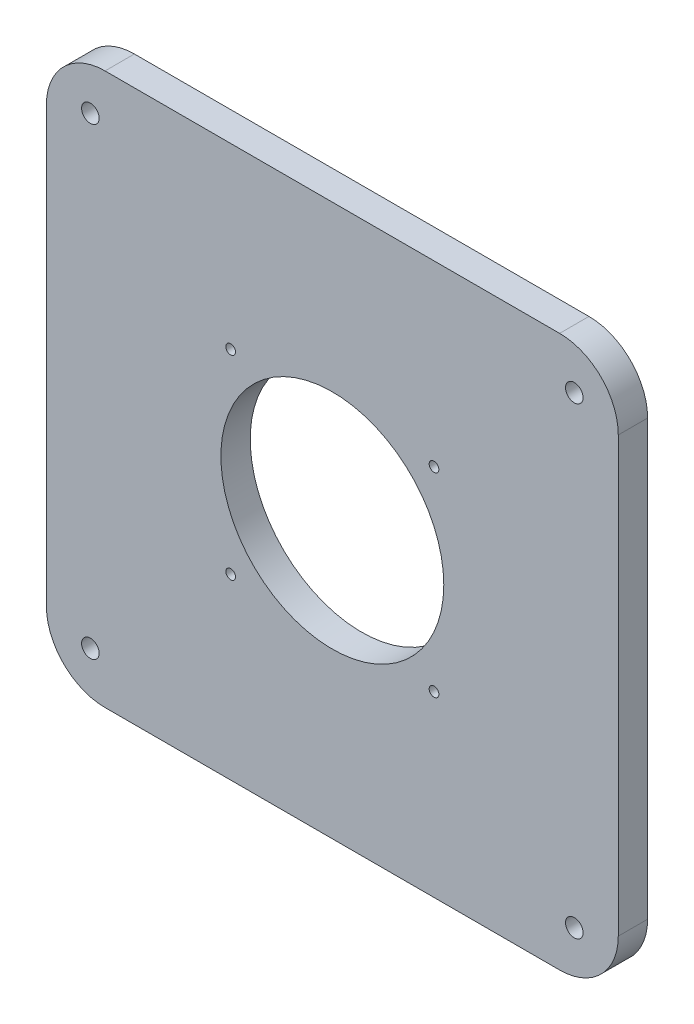
ISO-10303-21;
HEADER;
FILE_DESCRIPTION(('STEP AP214'),'2;1');
FILE_NAME('part.step','',(''),(''),'','','');
FILE_SCHEMA(('AUTOMOTIVE_DESIGN { 1 0 10303 214 1 1 1 1 }'));
ENDSEC;
DATA;
#1=APPLICATION_CONTEXT('core data for automotive mechanical design processes');
#2=APPLICATION_PROTOCOL_DEFINITION('international standard','automotive_design',2000,#1);
#3=PRODUCT_CONTEXT('',#1,'mechanical');
#4=PRODUCT('Part','Part','',(#3));
#5=PRODUCT_RELATED_PRODUCT_CATEGORY('part','',(#4));
#6=PRODUCT_DEFINITION_FORMATION('','',#4);
#7=PRODUCT_DEFINITION_CONTEXT('part definition',#1,'design');
#8=PRODUCT_DEFINITION('design','',#6,#7);
#9=PRODUCT_DEFINITION_SHAPE('','',#8);
#10=(LENGTH_UNIT() NAMED_UNIT(*) SI_UNIT(.MILLI.,.METRE.));
#11=(NAMED_UNIT(*) PLANE_ANGLE_UNIT() SI_UNIT($,.RADIAN.));
#12=(NAMED_UNIT(*) SI_UNIT($,.STERADIAN.) SOLID_ANGLE_UNIT());
#13=UNCERTAINTY_MEASURE_WITH_UNIT(LENGTH_MEASURE(1.E-05),#10,'distance_accuracy_value','');
#14=(GEOMETRIC_REPRESENTATION_CONTEXT(3) GLOBAL_UNCERTAINTY_ASSIGNED_CONTEXT((#13)) GLOBAL_UNIT_ASSIGNED_CONTEXT((#10,
#11,#12)) REPRESENTATION_CONTEXT('',''));
#15=CARTESIAN_POINT('',(0.,0.,0.));
#16=DIRECTION('',(0.,0.,1.));
#17=DIRECTION('',(1.,0.,0.));
#18=AXIS2_PLACEMENT_3D('',#15,#16,#17);
#19=CARTESIAN_POINT('',(0.,0.,10.));
#20=DIRECTION('',(0.,0.,1.));
#21=DIRECTION('',(1.,0.,0.));
#22=AXIS2_PLACEMENT_3D('',#19,#20,#21);
#23=PLANE('',#22);
#24=CARTESIAN_POINT('',(47.8314487158691,45.8022357400444,10.));
#25=DIRECTION('',(0.,0.,1.));
#26=DIRECTION('',(1.,0.,0.));
#27=AXIS2_PLACEMENT_3D('',#24,#25,#26);
#28=CIRCLE('',#27,1.65);
#29=CARTESIAN_POINT('',(49.4814487158691,45.8022357400444,10.));
#30=VERTEX_POINT('',#29);
#31=EDGE_CURVE('E218',#30,#30,#28,.T.);
#32=ORIENTED_EDGE('',*,*,#31,.F.);
#33=EDGE_LOOP('',(#32));
#34=FACE_BOUND('',#33,.T.);
#35=CARTESIAN_POINT('',(117.168551284131,112.197764259956,10.));
#36=DIRECTION('',(0.,0.,1.));
#37=DIRECTION('',(1.,0.,0.));
#38=AXIS2_PLACEMENT_3D('',#35,#36,#37);
#39=CIRCLE('',#38,1.65);
#40=CARTESIAN_POINT('',(118.818551284131,112.197764259956,10.));
#41=VERTEX_POINT('',#40);
#42=EDGE_CURVE('E206',#41,#41,#39,.T.);
#43=ORIENTED_EDGE('',*,*,#42,.F.);
#44=EDGE_LOOP('',(#43));
#45=FACE_BOUND('',#44,.T.);
#46=CARTESIAN_POINT('',(0.,0.,10.));
#47=DIRECTION('',(0.,0.,1.));
#48=DIRECTION('',(1.,0.,0.));
#49=AXIS2_PLACEMENT_3D('',#46,#47,#48);
#50=CIRCLE('',#49,3.);
#51=CARTESIAN_POINT('',(3.,0.,10.));
#52=VERTEX_POINT('',#51);
#53=EDGE_CURVE('E194',#52,#52,#50,.T.);
#54=ORIENTED_EDGE('',*,*,#53,.F.);
#55=EDGE_LOOP('',(#54));
#56=FACE_BOUND('',#55,.T.);
#57=CARTESIAN_POINT('',(165.,158.,10.));
#58=DIRECTION('',(0.,0.,1.));
#59=DIRECTION('',(1.,0.,0.));
#60=AXIS2_PLACEMENT_3D('',#57,#58,#59);
#61=CIRCLE('',#60,2.99999999999999);
#62=CARTESIAN_POINT('',(168.,158.,10.));
#63=VERTEX_POINT('',#62);
#64=EDGE_CURVE('E182',#63,#63,#61,.T.);
#65=ORIENTED_EDGE('',*,*,#64,.F.);
#66=EDGE_LOOP('',(#65));
#67=FACE_BOUND('',#66,.T.);
#68=DIRECTION('',(0.,-1.,0.));
#69=VECTOR('',#68,1.);
#70=CARTESIAN_POINT('',(-15.,173.,10.));
#71=LINE('',#70,#69);
#72=CARTESIAN_POINT('',(-15.,153.,10.));
#73=VERTEX_POINT('',#72);
#74=CARTESIAN_POINT('',(-15.,5.,10.));
#75=VERTEX_POINT('',#74);
#76=EDGE_CURVE('E139',#73,#75,#71,.T.);
#77=ORIENTED_EDGE('',*,*,#76,.T.);
#78=CARTESIAN_POINT('',(5.00000000000002,5.,10.));
#79=DIRECTION('',(0.,0.,1.));
#80=DIRECTION('',(1.,0.,0.));
#81=AXIS2_PLACEMENT_3D('',#78,#79,#80);
#82=CIRCLE('',#81,20.);
#83=CARTESIAN_POINT('',(5.00000000000002,-15.,10.));
#84=VERTEX_POINT('',#83);
#85=EDGE_CURVE('E154',#75,#84,#82,.T.);
#86=ORIENTED_EDGE('',*,*,#85,.T.);
#87=DIRECTION('',(1.,0.,0.));
#88=VECTOR('',#87,1.);
#89=CARTESIAN_POINT('',(-15.,-15.,10.));
#90=LINE('',#89,#88);
#91=CARTESIAN_POINT('',(160.,-15.,10.));
#92=VERTEX_POINT('',#91);
#93=EDGE_CURVE('E121',#84,#92,#90,.T.);
#94=ORIENTED_EDGE('',*,*,#93,.T.);
#95=CARTESIAN_POINT('',(160.,5.,10.));
#96=DIRECTION('',(0.,0.,1.));
#97=DIRECTION('',(1.,0.,0.));
#98=AXIS2_PLACEMENT_3D('',#95,#96,#97);
#99=CIRCLE('',#98,20.);
#100=CARTESIAN_POINT('',(180.,5.,10.));
#101=VERTEX_POINT('',#100);
#102=EDGE_CURVE('E152',#92,#101,#99,.T.);
#103=ORIENTED_EDGE('',*,*,#102,.T.);
#104=DIRECTION('',(0.,1.,0.));
#105=VECTOR('',#104,1.);
#106=CARTESIAN_POINT('',(180.,173.,10.));
#107=LINE('',#106,#105);
#108=CARTESIAN_POINT('',(180.,153.,10.));
#109=VERTEX_POINT('',#108);
#110=EDGE_CURVE('E165',#101,#109,#107,.T.);
#111=ORIENTED_EDGE('',*,*,#110,.T.);
#112=CARTESIAN_POINT('',(160.,153.,10.));
#113=DIRECTION('',(0.,0.,1.));
#114=DIRECTION('',(1.,0.,0.));
#115=AXIS2_PLACEMENT_3D('',#112,#113,#114);
#116=CIRCLE('',#115,20.);
#117=CARTESIAN_POINT('',(160.,173.,10.));
#118=VERTEX_POINT('',#117);
#119=EDGE_CURVE('E56',#109,#118,#116,.T.);
#120=ORIENTED_EDGE('',*,*,#119,.T.);
#121=DIRECTION('',(-1.,0.,0.));
#122=VECTOR('',#121,1.);
#123=CARTESIAN_POINT('',(-15.,173.,10.));
#124=LINE('',#123,#122);
#125=CARTESIAN_POINT('',(5.,173.,10.));
#126=VERTEX_POINT('',#125);
#127=EDGE_CURVE('E140',#118,#126,#124,.T.);
#128=ORIENTED_EDGE('',*,*,#127,.T.);
#129=CARTESIAN_POINT('',(5.,153.,10.));
#130=DIRECTION('',(0.,0.,1.));
#131=DIRECTION('',(1.,0.,0.));
#132=AXIS2_PLACEMENT_3D('',#129,#130,#131);
#133=CIRCLE('',#132,20.);
#134=EDGE_CURVE('E149',#126,#73,#133,.T.);
#135=ORIENTED_EDGE('',*,*,#134,.T.);
#136=EDGE_LOOP('',(#77,#86,#94,#103,#111,#120,#128,#135));
#137=FACE_BOUND('',#136,.T.);
#138=CARTESIAN_POINT('',(165.,0.,10.));
#139=DIRECTION('',(0.,0.,1.));
#140=DIRECTION('',(1.,0.,0.));
#141=AXIS2_PLACEMENT_3D('',#138,#139,#140);
#142=CIRCLE('',#141,2.99999999999999);
#143=CARTESIAN_POINT('',(168.,0.,10.));
#144=VERTEX_POINT('',#143);
#145=EDGE_CURVE('E134',#144,#144,#142,.T.);
#146=ORIENTED_EDGE('',*,*,#145,.F.);
#147=EDGE_LOOP('',(#146));
#148=FACE_BOUND('',#147,.T.);
#149=CARTESIAN_POINT('',(0.,158.,10.));
#150=DIRECTION('',(0.,0.,1.));
#151=DIRECTION('',(1.,0.,0.));
#152=AXIS2_PLACEMENT_3D('',#149,#150,#151);
#153=CIRCLE('',#152,3.);
#154=CARTESIAN_POINT('',(2.99999999999999,158.,10.));
#155=VERTEX_POINT('',#154);
#156=EDGE_CURVE('E188',#155,#155,#153,.T.);
#157=ORIENTED_EDGE('',*,*,#156,.F.);
#158=EDGE_LOOP('',(#157));
#159=FACE_BOUND('',#158,.T.);
#160=CARTESIAN_POINT('',(82.5,79.,10.));
#161=DIRECTION('',(0.,0.,1.));
#162=DIRECTION('',(1.,0.,0.));
#163=AXIS2_PLACEMENT_3D('',#160,#161,#162);
#164=CIRCLE('',#163,38.);
#165=CARTESIAN_POINT('',(120.5,79.,10.));
#166=VERTEX_POINT('',#165);
#167=EDGE_CURVE('E200',#166,#166,#164,.T.);
#168=ORIENTED_EDGE('',*,*,#167,.F.);
#169=EDGE_LOOP('',(#168));
#170=FACE_BOUND('',#169,.T.);
#171=CARTESIAN_POINT('',(47.8314487158691,112.197764259956,10.));
#172=DIRECTION('',(0.,0.,1.));
#173=DIRECTION('',(1.,0.,0.));
#174=AXIS2_PLACEMENT_3D('',#171,#172,#173);
#175=CIRCLE('',#174,1.65);
#176=CARTESIAN_POINT('',(49.4814487158691,112.197764259956,10.));
#177=VERTEX_POINT('',#176);
#178=EDGE_CURVE('E212',#177,#177,#175,.T.);
#179=ORIENTED_EDGE('',*,*,#178,.F.);
#180=EDGE_LOOP('',(#179));
#181=FACE_BOUND('',#180,.T.);
#182=CARTESIAN_POINT('',(117.168551284131,45.8022357400443,10.));
#183=DIRECTION('',(0.,0.,1.));
#184=DIRECTION('',(1.,0.,0.));
#185=AXIS2_PLACEMENT_3D('',#182,#183,#184);
#186=CIRCLE('',#185,1.65);
#187=CARTESIAN_POINT('',(118.818551284131,45.8022357400443,10.));
#188=VERTEX_POINT('',#187);
#189=EDGE_CURVE('E224',#188,#188,#186,.T.);
#190=ORIENTED_EDGE('',*,*,#189,.F.);
#191=EDGE_LOOP('',(#190));
#192=FACE_BOUND('',#191,.T.);
#193=ADVANCED_FACE('F35',(#34,#45,#56,#67,#137,#148,#159,#170,#181,#192),#23,.T.);
#194=CARTESIAN_POINT('',(0.,0.,0.));
#195=DIRECTION('',(0.,0.,1.));
#196=DIRECTION('',(1.,0.,0.));
#197=AXIS2_PLACEMENT_3D('',#194,#195,#196);
#198=PLANE('',#197);
#199=DIRECTION('',(1.,0.,0.));
#200=VECTOR('',#199,1.);
#201=CARTESIAN_POINT('',(-15.,-15.,0.));
#202=LINE('',#201,#200);
#203=CARTESIAN_POINT('',(5.00000000000002,-15.,0.));
#204=VERTEX_POINT('',#203);
#205=CARTESIAN_POINT('',(160.,-15.,0.));
#206=VERTEX_POINT('',#205);
#207=EDGE_CURVE('E118',#204,#206,#202,.T.);
#208=ORIENTED_EDGE('',*,*,#207,.F.);
#209=CARTESIAN_POINT('',(5.00000000000002,5.,0.));
#210=DIRECTION('',(0.,0.,1.));
#211=DIRECTION('',(1.,0.,0.));
#212=AXIS2_PLACEMENT_3D('',#209,#210,#211);
#213=CIRCLE('',#212,20.);
#214=CARTESIAN_POINT('',(-15.,5.,0.));
#215=VERTEX_POINT('',#214);
#216=EDGE_CURVE('E101',#204,#215,#213,.F.);
#217=ORIENTED_EDGE('',*,*,#216,.T.);
#218=DIRECTION('',(0.,-1.,0.));
#219=VECTOR('',#218,1.);
#220=CARTESIAN_POINT('',(-15.,173.,0.));
#221=LINE('',#220,#219);
#222=CARTESIAN_POINT('',(-15.,153.,0.));
#223=VERTEX_POINT('',#222);
#224=EDGE_CURVE('E129',#223,#215,#221,.T.);
#225=ORIENTED_EDGE('',*,*,#224,.F.);
#226=CARTESIAN_POINT('',(5.,153.,0.));
#227=DIRECTION('',(0.,0.,1.));
#228=DIRECTION('',(1.,0.,0.));
#229=AXIS2_PLACEMENT_3D('',#226,#227,#228);
#230=CIRCLE('',#229,20.);
#231=CARTESIAN_POINT('',(5.,173.,0.));
#232=VERTEX_POINT('',#231);
#233=EDGE_CURVE('E122',#223,#232,#230,.F.);
#234=ORIENTED_EDGE('',*,*,#233,.T.);
#235=DIRECTION('',(-1.,0.,0.));
#236=VECTOR('',#235,1.);
#237=CARTESIAN_POINT('',(-15.,173.,0.));
#238=LINE('',#237,#236);
#239=CARTESIAN_POINT('',(160.,173.,0.));
#240=VERTEX_POINT('',#239);
#241=EDGE_CURVE('E132',#240,#232,#238,.T.);
#242=ORIENTED_EDGE('',*,*,#241,.F.);
#243=CARTESIAN_POINT('',(160.,153.,0.));
#244=DIRECTION('',(0.,0.,1.));
#245=DIRECTION('',(1.,0.,0.));
#246=AXIS2_PLACEMENT_3D('',#243,#244,#245);
#247=CIRCLE('',#246,20.);
#248=CARTESIAN_POINT('',(180.,153.,0.));
#249=VERTEX_POINT('',#248);
#250=EDGE_CURVE('E143',#240,#249,#247,.F.);
#251=ORIENTED_EDGE('',*,*,#250,.T.);
#252=DIRECTION('',(0.,1.,0.));
#253=VECTOR('',#252,1.);
#254=CARTESIAN_POINT('',(180.,173.,0.));
#255=LINE('',#254,#253);
#256=CARTESIAN_POINT('',(180.,5.,0.));
#257=VERTEX_POINT('',#256);
#258=EDGE_CURVE('E128',#257,#249,#255,.T.);
#259=ORIENTED_EDGE('',*,*,#258,.F.);
#260=CARTESIAN_POINT('',(160.,5.,0.));
#261=DIRECTION('',(0.,0.,1.));
#262=DIRECTION('',(1.,0.,0.));
#263=AXIS2_PLACEMENT_3D('',#260,#261,#262);
#264=CIRCLE('',#263,20.);
#265=EDGE_CURVE('E112',#257,#206,#264,.F.);
#266=ORIENTED_EDGE('',*,*,#265,.T.);
#267=EDGE_LOOP('',(#208,#217,#225,#234,#242,#251,#259,#266));
#268=FACE_BOUND('',#267,.T.);
#269=CARTESIAN_POINT('',(165.,0.,0.));
#270=DIRECTION('',(0.,0.,1.));
#271=DIRECTION('',(1.,0.,0.));
#272=AXIS2_PLACEMENT_3D('',#269,#270,#271);
#273=CIRCLE('',#272,2.99999999999999);
#274=CARTESIAN_POINT('',(168.,0.,0.));
#275=VERTEX_POINT('',#274);
#276=EDGE_CURVE('E179',#275,#275,#273,.T.);
#277=ORIENTED_EDGE('',*,*,#276,.T.);
#278=EDGE_LOOP('',(#277));
#279=FACE_BOUND('',#278,.T.);
#280=CARTESIAN_POINT('',(165.,158.,0.));
#281=DIRECTION('',(0.,0.,1.));
#282=DIRECTION('',(1.,0.,0.));
#283=AXIS2_PLACEMENT_3D('',#280,#281,#282);
#284=CIRCLE('',#283,2.99999999999999);
#285=CARTESIAN_POINT('',(168.,158.,0.));
#286=VERTEX_POINT('',#285);
#287=EDGE_CURVE('E185',#286,#286,#284,.T.);
#288=ORIENTED_EDGE('',*,*,#287,.T.);
#289=EDGE_LOOP('',(#288));
#290=FACE_BOUND('',#289,.T.);
#291=CARTESIAN_POINT('',(0.,158.,0.));
#292=DIRECTION('',(0.,0.,1.));
#293=DIRECTION('',(1.,0.,0.));
#294=AXIS2_PLACEMENT_3D('',#291,#292,#293);
#295=CIRCLE('',#294,3.);
#296=CARTESIAN_POINT('',(2.99999999999999,158.,0.));
#297=VERTEX_POINT('',#296);
#298=EDGE_CURVE('E191',#297,#297,#295,.T.);
#299=ORIENTED_EDGE('',*,*,#298,.T.);
#300=EDGE_LOOP('',(#299));
#301=FACE_BOUND('',#300,.T.);
#302=CARTESIAN_POINT('',(0.,0.,0.));
#303=DIRECTION('',(0.,0.,1.));
#304=DIRECTION('',(1.,0.,0.));
#305=AXIS2_PLACEMENT_3D('',#302,#303,#304);
#306=CIRCLE('',#305,3.);
#307=CARTESIAN_POINT('',(3.,0.,0.));
#308=VERTEX_POINT('',#307);
#309=EDGE_CURVE('E197',#308,#308,#306,.T.);
#310=ORIENTED_EDGE('',*,*,#309,.T.);
#311=EDGE_LOOP('',(#310));
#312=FACE_BOUND('',#311,.T.);
#313=CARTESIAN_POINT('',(82.5,79.,0.));
#314=DIRECTION('',(0.,0.,1.));
#315=DIRECTION('',(1.,0.,0.));
#316=AXIS2_PLACEMENT_3D('',#313,#314,#315);
#317=CIRCLE('',#316,38.);
#318=CARTESIAN_POINT('',(120.5,79.,0.));
#319=VERTEX_POINT('',#318);
#320=EDGE_CURVE('E203',#319,#319,#317,.T.);
#321=ORIENTED_EDGE('',*,*,#320,.T.);
#322=EDGE_LOOP('',(#321));
#323=FACE_BOUND('',#322,.T.);
#324=CARTESIAN_POINT('',(117.168551284131,112.197764259956,0.));
#325=DIRECTION('',(0.,0.,1.));
#326=DIRECTION('',(1.,0.,0.));
#327=AXIS2_PLACEMENT_3D('',#324,#325,#326);
#328=CIRCLE('',#327,1.65);
#329=CARTESIAN_POINT('',(118.818551284131,112.197764259956,0.));
#330=VERTEX_POINT('',#329);
#331=EDGE_CURVE('E209',#330,#330,#328,.T.);
#332=ORIENTED_EDGE('',*,*,#331,.T.);
#333=EDGE_LOOP('',(#332));
#334=FACE_BOUND('',#333,.T.);
#335=CARTESIAN_POINT('',(47.8314487158691,112.197764259956,0.));
#336=DIRECTION('',(0.,0.,1.));
#337=DIRECTION('',(1.,0.,0.));
#338=AXIS2_PLACEMENT_3D('',#335,#336,#337);
#339=CIRCLE('',#338,1.65);
#340=CARTESIAN_POINT('',(49.4814487158691,112.197764259956,0.));
#341=VERTEX_POINT('',#340);
#342=EDGE_CURVE('E215',#341,#341,#339,.T.);
#343=ORIENTED_EDGE('',*,*,#342,.T.);
#344=EDGE_LOOP('',(#343));
#345=FACE_BOUND('',#344,.T.);
#346=CARTESIAN_POINT('',(47.8314487158691,45.8022357400444,0.));
#347=DIRECTION('',(0.,0.,1.));
#348=DIRECTION('',(1.,0.,0.));
#349=AXIS2_PLACEMENT_3D('',#346,#347,#348);
#350=CIRCLE('',#349,1.65);
#351=CARTESIAN_POINT('',(49.4814487158691,45.8022357400444,0.));
#352=VERTEX_POINT('',#351);
#353=EDGE_CURVE('E221',#352,#352,#350,.T.);
#354=ORIENTED_EDGE('',*,*,#353,.T.);
#355=EDGE_LOOP('',(#354));
#356=FACE_BOUND('',#355,.T.);
#357=CARTESIAN_POINT('',(117.168551284131,45.8022357400443,0.));
#358=DIRECTION('',(0.,0.,1.));
#359=DIRECTION('',(1.,0.,0.));
#360=AXIS2_PLACEMENT_3D('',#357,#358,#359);
#361=CIRCLE('',#360,1.65);
#362=CARTESIAN_POINT('',(118.818551284131,45.8022357400443,0.));
#363=VERTEX_POINT('',#362);
#364=EDGE_CURVE('E227',#363,#363,#361,.T.);
#365=ORIENTED_EDGE('',*,*,#364,.T.);
#366=EDGE_LOOP('',(#365));
#367=FACE_BOUND('',#366,.T.);
#368=ADVANCED_FACE('F125',(#268,#279,#290,#301,#312,#323,#334,#345,#356,#367),#198,.F.);
#369=CARTESIAN_POINT('',(-15.,173.,10.));
#370=DIRECTION('',(1.,0.,0.));
#371=DIRECTION('',(0.,1.,0.));
#372=AXIS2_PLACEMENT_3D('',#369,#370,#371);
#373=PLANE('',#372);
#374=ORIENTED_EDGE('',*,*,#224,.T.);
#375=DIRECTION('',(0.,0.,-1.));
#376=VECTOR('',#375,1.);
#377=CARTESIAN_POINT('',(-15.,5.,10.));
#378=LINE('',#377,#376);
#379=EDGE_CURVE('E106',#215,#75,#378,.F.);
#380=ORIENTED_EDGE('',*,*,#379,.T.);
#381=ORIENTED_EDGE('',*,*,#76,.F.);
#382=DIRECTION('',(0.,0.,-1.));
#383=VECTOR('',#382,1.);
#384=CARTESIAN_POINT('',(-15.,153.,10.));
#385=LINE('',#384,#383);
#386=EDGE_CURVE('E111',#73,#223,#385,.T.);
#387=ORIENTED_EDGE('',*,*,#386,.T.);
#388=EDGE_LOOP('',(#374,#380,#381,#387));
#389=FACE_BOUND('',#388,.T.);
#390=ADVANCED_FACE('F242',(#389),#373,.F.);
#391=CARTESIAN_POINT('',(-15.,-15.,10.));
#392=DIRECTION('',(0.,1.,0.));
#393=DIRECTION('',(0.,0.,1.));
#394=AXIS2_PLACEMENT_3D('',#391,#392,#393);
#395=PLANE('',#394);
#396=ORIENTED_EDGE('',*,*,#93,.F.);
#397=DIRECTION('',(0.,0.,-1.));
#398=VECTOR('',#397,1.);
#399=CARTESIAN_POINT('',(5.00000000000002,-15.,10.));
#400=LINE('',#399,#398);
#401=EDGE_CURVE('E105',#84,#204,#400,.T.);
#402=ORIENTED_EDGE('',*,*,#401,.T.);
#403=ORIENTED_EDGE('',*,*,#207,.T.);
#404=DIRECTION('',(0.,0.,-1.));
#405=VECTOR('',#404,1.);
#406=CARTESIAN_POINT('',(160.,-15.,10.));
#407=LINE('',#406,#405);
#408=EDGE_CURVE('E123',#206,#92,#407,.F.);
#409=ORIENTED_EDGE('',*,*,#408,.T.);
#410=EDGE_LOOP('',(#396,#402,#403,#409));
#411=FACE_BOUND('',#410,.T.);
#412=ADVANCED_FACE('F117',(#411),#395,.F.);
#413=CARTESIAN_POINT('',(180.,173.,10.));
#414=DIRECTION('',(-1.,0.,0.));
#415=DIRECTION('',(0.,-1.,0.));
#416=AXIS2_PLACEMENT_3D('',#413,#414,#415);
#417=PLANE('',#416);
#418=ORIENTED_EDGE('',*,*,#110,.F.);
#419=DIRECTION('',(0.,0.,-1.));
#420=VECTOR('',#419,1.);
#421=CARTESIAN_POINT('',(180.,5.,10.));
#422=LINE('',#421,#420);
#423=EDGE_CURVE('E158',#101,#257,#422,.T.);
#424=ORIENTED_EDGE('',*,*,#423,.T.);
#425=ORIENTED_EDGE('',*,*,#258,.T.);
#426=DIRECTION('',(0.,0.,-1.));
#427=VECTOR('',#426,1.);
#428=CARTESIAN_POINT('',(180.,153.,10.));
#429=LINE('',#428,#427);
#430=EDGE_CURVE('E156',#249,#109,#429,.F.);
#431=ORIENTED_EDGE('',*,*,#430,.T.);
#432=EDGE_LOOP('',(#418,#424,#425,#431));
#433=FACE_BOUND('',#432,.T.);
#434=ADVANCED_FACE('F163',(#433),#417,.F.);
#435=CARTESIAN_POINT('',(-15.,173.,10.));
#436=DIRECTION('',(0.,-1.,0.));
#437=DIRECTION('',(0.,0.,-1.));
#438=AXIS2_PLACEMENT_3D('',#435,#436,#437);
#439=PLANE('',#438);
#440=ORIENTED_EDGE('',*,*,#127,.F.);
#441=DIRECTION('',(0.,0.,-1.));
#442=VECTOR('',#441,1.);
#443=CARTESIAN_POINT('',(160.,173.,10.));
#444=LINE('',#443,#442);
#445=EDGE_CURVE('E11',#118,#240,#444,.T.);
#446=ORIENTED_EDGE('',*,*,#445,.T.);
#447=ORIENTED_EDGE('',*,*,#241,.T.);
#448=DIRECTION('',(0.,0.,-1.));
#449=VECTOR('',#448,1.);
#450=CARTESIAN_POINT('',(5.,173.,10.));
#451=LINE('',#450,#449);
#452=EDGE_CURVE('E43',#232,#126,#451,.F.);
#453=ORIENTED_EDGE('',*,*,#452,.T.);
#454=EDGE_LOOP('',(#440,#446,#447,#453));
#455=FACE_BOUND('',#454,.T.);
#456=ADVANCED_FACE('F172',(#455),#439,.F.);
#457=CARTESIAN_POINT('',(165.,0.,10.));
#458=DIRECTION('',(0.,0.,-1.));
#459=DIRECTION('',(-1.,0.,0.));
#460=AXIS2_PLACEMENT_3D('',#457,#458,#459);
#461=CYLINDRICAL_SURFACE('',#460,2.99999999999999);
#462=ORIENTED_EDGE('',*,*,#145,.T.);
#463=EDGE_LOOP('',(#462));
#464=FACE_BOUND('',#463,.T.);
#465=ORIENTED_EDGE('',*,*,#276,.F.);
#466=EDGE_LOOP('',(#465));
#467=FACE_BOUND('',#466,.T.);
#468=ADVANCED_FACE('F247',(#464,#467),#461,.F.);
#469=CARTESIAN_POINT('',(165.,158.,10.));
#470=DIRECTION('',(0.,0.,-1.));
#471=DIRECTION('',(-1.,0.,0.));
#472=AXIS2_PLACEMENT_3D('',#469,#470,#471);
#473=CYLINDRICAL_SURFACE('',#472,2.99999999999999);
#474=ORIENTED_EDGE('',*,*,#64,.T.);
#475=EDGE_LOOP('',(#474));
#476=FACE_BOUND('',#475,.T.);
#477=ORIENTED_EDGE('',*,*,#287,.F.);
#478=EDGE_LOOP('',(#477));
#479=FACE_BOUND('',#478,.T.);
#480=ADVANCED_FACE('F314',(#476,#479),#473,.F.);
#481=CARTESIAN_POINT('',(0.,158.,10.));
#482=DIRECTION('',(0.,0.,-1.));
#483=DIRECTION('',(-1.,0.,0.));
#484=AXIS2_PLACEMENT_3D('',#481,#482,#483);
#485=CYLINDRICAL_SURFACE('',#484,3.);
#486=ORIENTED_EDGE('',*,*,#156,.T.);
#487=EDGE_LOOP('',(#486));
#488=FACE_BOUND('',#487,.T.);
#489=ORIENTED_EDGE('',*,*,#298,.F.);
#490=EDGE_LOOP('',(#489));
#491=FACE_BOUND('',#490,.T.);
#492=ADVANCED_FACE('F311',(#488,#491),#485,.F.);
#493=CARTESIAN_POINT('',(0.,0.,10.));
#494=DIRECTION('',(0.,0.,-1.));
#495=DIRECTION('',(-1.,0.,0.));
#496=AXIS2_PLACEMENT_3D('',#493,#494,#495);
#497=CYLINDRICAL_SURFACE('',#496,3.);
#498=ORIENTED_EDGE('',*,*,#53,.T.);
#499=EDGE_LOOP('',(#498));
#500=FACE_BOUND('',#499,.T.);
#501=ORIENTED_EDGE('',*,*,#309,.F.);
#502=EDGE_LOOP('',(#501));
#503=FACE_BOUND('',#502,.T.);
#504=ADVANCED_FACE('F307',(#500,#503),#497,.F.);
#505=CARTESIAN_POINT('',(82.5,79.,10.));
#506=DIRECTION('',(0.,0.,-1.));
#507=DIRECTION('',(-1.,0.,0.));
#508=AXIS2_PLACEMENT_3D('',#505,#506,#507);
#509=CYLINDRICAL_SURFACE('',#508,38.);
#510=ORIENTED_EDGE('',*,*,#167,.T.);
#511=EDGE_LOOP('',(#510));
#512=FACE_BOUND('',#511,.T.);
#513=ORIENTED_EDGE('',*,*,#320,.F.);
#514=EDGE_LOOP('',(#513));
#515=FACE_BOUND('',#514,.T.);
#516=ADVANCED_FACE('F303',(#512,#515),#509,.F.);
#517=CARTESIAN_POINT('',(117.168551284131,112.197764259956,10.));
#518=DIRECTION('',(0.,0.,-1.));
#519=DIRECTION('',(-1.,0.,0.));
#520=AXIS2_PLACEMENT_3D('',#517,#518,#519);
#521=CYLINDRICAL_SURFACE('',#520,1.65);
#522=ORIENTED_EDGE('',*,*,#42,.T.);
#523=EDGE_LOOP('',(#522));
#524=FACE_BOUND('',#523,.T.);
#525=ORIENTED_EDGE('',*,*,#331,.F.);
#526=EDGE_LOOP('',(#525));
#527=FACE_BOUND('',#526,.T.);
#528=ADVANCED_FACE('F285',(#524,#527),#521,.F.);
#529=CARTESIAN_POINT('',(47.8314487158691,112.197764259956,10.));
#530=DIRECTION('',(0.,0.,-1.));
#531=DIRECTION('',(-1.,0.,0.));
#532=AXIS2_PLACEMENT_3D('',#529,#530,#531);
#533=CYLINDRICAL_SURFACE('',#532,1.65);
#534=ORIENTED_EDGE('',*,*,#178,.T.);
#535=EDGE_LOOP('',(#534));
#536=FACE_BOUND('',#535,.T.);
#537=ORIENTED_EDGE('',*,*,#342,.F.);
#538=EDGE_LOOP('',(#537));
#539=FACE_BOUND('',#538,.T.);
#540=ADVANCED_FACE('F281',(#536,#539),#533,.F.);
#541=CARTESIAN_POINT('',(47.8314487158691,45.8022357400444,10.));
#542=DIRECTION('',(0.,0.,-1.));
#543=DIRECTION('',(-1.,0.,0.));
#544=AXIS2_PLACEMENT_3D('',#541,#542,#543);
#545=CYLINDRICAL_SURFACE('',#544,1.65);
#546=ORIENTED_EDGE('',*,*,#31,.T.);
#547=EDGE_LOOP('',(#546));
#548=FACE_BOUND('',#547,.T.);
#549=ORIENTED_EDGE('',*,*,#353,.F.);
#550=EDGE_LOOP('',(#549));
#551=FACE_BOUND('',#550,.T.);
#552=ADVANCED_FACE('F284',(#548,#551),#545,.F.);
#553=CARTESIAN_POINT('',(117.168551284131,45.8022357400443,10.));
#554=DIRECTION('',(0.,0.,-1.));
#555=DIRECTION('',(-1.,0.,0.));
#556=AXIS2_PLACEMENT_3D('',#553,#554,#555);
#557=CYLINDRICAL_SURFACE('',#556,1.65);
#558=ORIENTED_EDGE('',*,*,#189,.T.);
#559=EDGE_LOOP('',(#558));
#560=FACE_BOUND('',#559,.T.);
#561=ORIENTED_EDGE('',*,*,#364,.F.);
#562=EDGE_LOOP('',(#561));
#563=FACE_BOUND('',#562,.T.);
#564=ADVANCED_FACE('F233',(#560,#563),#557,.F.);
#565=CARTESIAN_POINT('',(5.00000000000002,5.,10.));
#566=DIRECTION('',(0.,0.,-1.));
#567=DIRECTION('',(-1.,0.,0.));
#568=AXIS2_PLACEMENT_3D('',#565,#566,#567);
#569=CYLINDRICAL_SURFACE('',#568,20.);
#570=ORIENTED_EDGE('',*,*,#85,.F.);
#571=ORIENTED_EDGE('',*,*,#379,.F.);
#572=ORIENTED_EDGE('',*,*,#216,.F.);
#573=ORIENTED_EDGE('',*,*,#401,.F.);
#574=EDGE_LOOP('',(#570,#571,#572,#573));
#575=FACE_BOUND('',#574,.T.);
#576=ADVANCED_FACE('F104',(#575),#569,.T.);
#577=CARTESIAN_POINT('',(160.,5.,10.));
#578=DIRECTION('',(0.,0.,-1.));
#579=DIRECTION('',(-1.,0.,0.));
#580=AXIS2_PLACEMENT_3D('',#577,#578,#579);
#581=CYLINDRICAL_SURFACE('',#580,20.);
#582=ORIENTED_EDGE('',*,*,#102,.F.);
#583=ORIENTED_EDGE('',*,*,#408,.F.);
#584=ORIENTED_EDGE('',*,*,#265,.F.);
#585=ORIENTED_EDGE('',*,*,#423,.F.);
#586=EDGE_LOOP('',(#582,#583,#584,#585));
#587=FACE_BOUND('',#586,.T.);
#588=ADVANCED_FACE('F261',(#587),#581,.T.);
#589=CARTESIAN_POINT('',(160.,153.,10.));
#590=DIRECTION('',(0.,0.,-1.));
#591=DIRECTION('',(-1.,0.,0.));
#592=AXIS2_PLACEMENT_3D('',#589,#590,#591);
#593=CYLINDRICAL_SURFACE('',#592,20.);
#594=ORIENTED_EDGE('',*,*,#119,.F.);
#595=ORIENTED_EDGE('',*,*,#430,.F.);
#596=ORIENTED_EDGE('',*,*,#250,.F.);
#597=ORIENTED_EDGE('',*,*,#445,.F.);
#598=EDGE_LOOP('',(#594,#595,#596,#597));
#599=FACE_BOUND('',#598,.T.);
#600=ADVANCED_FACE('F171',(#599),#593,.T.);
#601=CARTESIAN_POINT('',(5.,153.,10.));
#602=DIRECTION('',(0.,0.,-1.));
#603=DIRECTION('',(-1.,0.,0.));
#604=AXIS2_PLACEMENT_3D('',#601,#602,#603);
#605=CYLINDRICAL_SURFACE('',#604,20.);
#606=ORIENTED_EDGE('',*,*,#134,.F.);
#607=ORIENTED_EDGE('',*,*,#452,.F.);
#608=ORIENTED_EDGE('',*,*,#233,.F.);
#609=ORIENTED_EDGE('',*,*,#386,.F.);
#610=EDGE_LOOP('',(#606,#607,#608,#609));
#611=FACE_BOUND('',#610,.T.);
#612=ADVANCED_FACE('F37',(#611),#605,.T.);
#613=CLOSED_SHELL('',(#193,#368,#390,#412,#434,#456,#468,#480,#492,#504,#516,#528,#540,#552,
#564,#576,#588,#600,#612));
#614=MANIFOLD_SOLID_BREP('B2',#613);
#615=ADVANCED_BREP_SHAPE_REPRESENTATION('',(#18,#614),#14);
#616=SHAPE_DEFINITION_REPRESENTATION(#9,#615);
ENDSEC;
END-ISO-10303-21;
